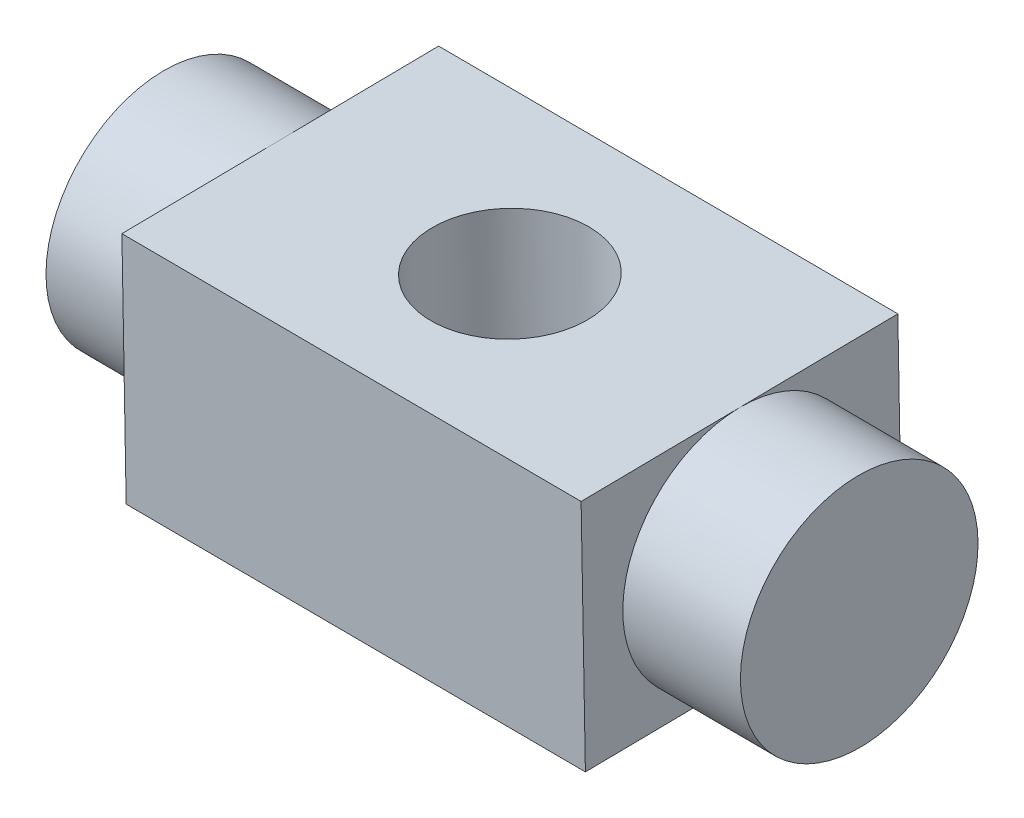
ISO-10303-21;
HEADER;
FILE_DESCRIPTION(('STEP AP214'),'2;1');
FILE_NAME('part.step','',(''),(''),'','','');
FILE_SCHEMA(('AUTOMOTIVE_DESIGN { 1 0 10303 214 1 1 1 1 }'));
ENDSEC;
DATA;
#1=APPLICATION_CONTEXT('core data for automotive mechanical design processes');
#2=APPLICATION_PROTOCOL_DEFINITION('international standard','automotive_design',2000,#1);
#3=PRODUCT_CONTEXT('',#1,'mechanical');
#4=PRODUCT('Part','Part','',(#3));
#5=PRODUCT_RELATED_PRODUCT_CATEGORY('part','',(#4));
#6=PRODUCT_DEFINITION_FORMATION('','',#4);
#7=PRODUCT_DEFINITION_CONTEXT('part definition',#1,'design');
#8=PRODUCT_DEFINITION('design','',#6,#7);
#9=PRODUCT_DEFINITION_SHAPE('','',#8);
#10=(LENGTH_UNIT() NAMED_UNIT(*) SI_UNIT(.MILLI.,.METRE.));
#11=(NAMED_UNIT(*) PLANE_ANGLE_UNIT() SI_UNIT($,.RADIAN.));
#12=(NAMED_UNIT(*) SI_UNIT($,.STERADIAN.) SOLID_ANGLE_UNIT());
#13=UNCERTAINTY_MEASURE_WITH_UNIT(LENGTH_MEASURE(1.E-05),#10,'distance_accuracy_value','');
#14=(GEOMETRIC_REPRESENTATION_CONTEXT(3) GLOBAL_UNCERTAINTY_ASSIGNED_CONTEXT((#13)) GLOBAL_UNIT_ASSIGNED_CONTEXT((#10,
#11,#12)) REPRESENTATION_CONTEXT('',''));
#15=CARTESIAN_POINT('',(0.,0.,0.));
#16=DIRECTION('',(0.,0.,1.));
#17=DIRECTION('',(1.,0.,0.));
#18=AXIS2_PLACEMENT_3D('',#15,#16,#17);
#19=CARTESIAN_POINT('',(0.00999526123676279,8.28598475368137,-1.99965126766026));
#20=DIRECTION('',(0.00499763061838042,0.0179923768409701,-0.999825633830127));
#21=DIRECTION('',(-8.99338113296644E-05,0.999838124085901,0.0179921520751982));
#22=AXIS2_PLACEMENT_3D('',#19,#20,#21);
#23=PLANE('',#22);
#24=DIRECTION('',(-8.99338113285542E-05,0.999838124085901,0.0179921520751982));
#25=VECTOR('',#24,1.);
#26=CARTESIAN_POINT('',(-2.91827772565965,6.78622756755307,-2.04127714900682));
#27=LINE('',#26,#25);
#28=CARTESIAN_POINT('',(-2.91827772565965,6.78622756755307,-2.04127714900682));
#29=VERTEX_POINT('',#28);
#30=CARTESIAN_POINT('',(-2.91854752709363,9.78574193981077,-1.98730069278123));
#31=VERTEX_POINT('',#30);
#32=EDGE_CURVE('E11',#29,#31,#27,.T.);
#33=ORIENTED_EDGE('',*,*,#32,.T.);
#34=DIRECTION('',(0.999987507722027,-1.87263780084994E-13,0.00499843974537991));
#35=VECTOR('',#34,1.);
#36=CARTESIAN_POINT('',(-2.91854752709363,9.78574193981077,-1.98730069278123));
#37=LINE('',#36,#35);
#38=CARTESIAN_POINT('',(2.93826824813318,9.78574193980968,-1.9580253863137));
#39=VERTEX_POINT('',#38);
#40=EDGE_CURVE('E25',#31,#39,#37,.T.);
#41=ORIENTED_EDGE('',*,*,#40,.T.);
#42=DIRECTION('',(8.99338113296644E-05,-0.999838124085901,-0.0179921520751982));
#43=VECTOR('',#42,1.);
#44=CARTESIAN_POINT('',(2.93853804956717,6.78622756755198,-2.01200184253929));
#45=LINE('',#44,#43);
#46=CARTESIAN_POINT('',(2.93853804956717,6.78622756755198,-2.01200184253929));
#47=VERTEX_POINT('',#46);
#48=EDGE_CURVE('E163',#39,#47,#45,.T.);
#49=ORIENTED_EDGE('',*,*,#48,.T.);
#50=DIRECTION('',(-0.999987507722027,1.86126613253846E-13,-0.00499843974537993));
#51=VECTOR('',#50,1.);
#52=CARTESIAN_POINT('',(2.93853804956717,6.78622756755198,-2.01200184253929));
#53=LINE('',#52,#51);
#54=EDGE_CURVE('E161',#47,#29,#53,.T.);
#55=ORIENTED_EDGE('',*,*,#54,.T.);
#56=EDGE_LOOP('',(#33,#41,#49,#55));
#57=FACE_BOUND('',#56,.T.);
#58=ADVANCED_FACE('F17',(#57),#23,.T.);
#59=CARTESIAN_POINT('',(-2.92854278833039,9.74975718612883,0.0123505748790235));
#60=DIRECTION('',(-8.9933811328527E-05,0.999838124085901,0.0179921520751982));
#61=DIRECTION('',(0.999987507722027,-1.87263780084993E-13,0.00499843974537991));
#62=AXIS2_PLACEMENT_3D('',#59,#60,#61);
#63=PLANE('',#62);
#64=CARTESIAN_POINT('',(-0.000134900716996975,9.74975718612828,0.0269882281127875));
#65=DIRECTION('',(8.9933811328527E-05,-0.999838124085901,-0.0179921520751982));
#66=DIRECTION('',(0.00499763061838042,0.0179923768409701,-0.999825633830127));
#67=AXIS2_PLACEMENT_3D('',#64,#65,#66);
#68=CIRCLE('',#67,1.);
#69=CARTESIAN_POINT('',(0.00486272990138344,9.76774956296925,-0.972837405717339));
#70=VERTEX_POINT('',#69);
#71=EDGE_CURVE('E156',#70,#70,#68,.T.);
#72=ORIENTED_EDGE('',*,*,#71,.T.);
#73=EDGE_LOOP('',(#72));
#74=FACE_BOUND('',#73,.T.);
#75=DIRECTION('',(0.00499763061838042,0.0179923768409701,-0.999825633830127));
#76=VECTOR('',#75,1.);
#77=CARTESIAN_POINT('',(2.92827298689642,9.74975718612774,0.0416258813465515));
#78=LINE('',#77,#76);
#79=CARTESIAN_POINT('',(2.91827772565966,9.7137724324458,2.04127714900681));
#80=VERTEX_POINT('',#79);
#81=CARTESIAN_POINT('',(2.92827298689642,9.74975718612774,0.0416258813465517));
#82=VERTEX_POINT('',#81);
#83=EDGE_CURVE('E152',#80,#82,#78,.T.);
#84=ORIENTED_EDGE('',*,*,#83,.T.);
#85=DIRECTION('',(0.00499763061838042,0.0179923768409701,-0.999825633830127));
#86=VECTOR('',#85,1.);
#87=CARTESIAN_POINT('',(2.92827298689642,9.74975718612774,0.0416258813465515));
#88=LINE('',#87,#86);
#89=EDGE_CURVE('E148',#82,#39,#88,.T.);
#90=ORIENTED_EDGE('',*,*,#89,.T.);
#91=ORIENTED_EDGE('',*,*,#40,.F.);
#92=DIRECTION('',(0.00499763061838042,0.0179923768409701,-0.999825633830127));
#93=VECTOR('',#92,1.);
#94=CARTESIAN_POINT('',(-2.92854278833039,9.74975718612883,0.0123505748790235));
#95=LINE('',#94,#93);
#96=CARTESIAN_POINT('',(-2.92854278833039,9.74975718612883,0.0123505748790233));
#97=VERTEX_POINT('',#96);
#98=EDGE_CURVE('E144',#97,#31,#95,.T.);
#99=ORIENTED_EDGE('',*,*,#98,.F.);
#100=DIRECTION('',(0.00499763061838042,0.0179923768409701,-0.999825633830127));
#101=VECTOR('',#100,1.);
#102=CARTESIAN_POINT('',(-2.92854278833039,9.74975718612883,0.0123505748790235));
#103=LINE('',#102,#101);
#104=CARTESIAN_POINT('',(-2.93853804956715,9.71377243244689,2.01200184253927));
#105=VERTEX_POINT('',#104);
#106=EDGE_CURVE('E82',#105,#97,#103,.T.);
#107=ORIENTED_EDGE('',*,*,#106,.F.);
#108=DIRECTION('',(-0.999987507722027,1.87263780084994E-13,-0.00499843974537991));
#109=VECTOR('',#108,1.);
#110=CARTESIAN_POINT('',(-2.93853804956715,9.71377243244689,2.01200184253927));
#111=LINE('',#110,#109);
#112=EDGE_CURVE('E138',#80,#105,#111,.T.);
#113=ORIENTED_EDGE('',*,*,#112,.F.);
#114=EDGE_LOOP('',(#84,#90,#91,#99,#107,#113));
#115=FACE_BOUND('',#114,.T.);
#116=ADVANCED_FACE('F188',(#74,#115),#63,.T.);
#117=CARTESIAN_POINT('',(2.92854278833041,6.75024281387004,-0.0123505748790431));
#118=DIRECTION('',(8.99338113296644E-05,-0.999838124085901,-0.0179921520751982));
#119=DIRECTION('',(-0.999987507722027,1.86126613253846E-13,-0.00499843974537993));
#120=AXIS2_PLACEMENT_3D('',#117,#118,#119);
#121=PLANE('',#120);
#122=CARTESIAN_POINT('',(0.000134900716992018,6.75024281387058,-0.0269882281128071));
#123=DIRECTION('',(-8.99338113296644E-05,0.999838124085901,0.0179921520751982));
#124=DIRECTION('',(0.00499763061838042,0.0179923768409701,-0.999825633830127));
#125=AXIS2_PLACEMENT_3D('',#122,#123,#124);
#126=CIRCLE('',#125,1.);
#127=CARTESIAN_POINT('',(0.00513253133537244,6.76823519071155,-1.02681386194293));
#128=VERTEX_POINT('',#127);
#129=EDGE_CURVE('E92',#128,#128,#126,.T.);
#130=ORIENTED_EDGE('',*,*,#129,.T.);
#131=EDGE_LOOP('',(#130));
#132=FACE_BOUND('',#131,.T.);
#133=DIRECTION('',(-0.00499763061838042,-0.0179923768409701,0.999825633830127));
#134=VECTOR('',#133,1.);
#135=CARTESIAN_POINT('',(-2.92827298689642,6.75024281387113,-0.0416258813465712));
#136=LINE('',#135,#134);
#137=CARTESIAN_POINT('',(-2.92827298689642,6.75024281387113,-0.0416258813465712));
#138=VERTEX_POINT('',#137);
#139=EDGE_CURVE('E70',#29,#138,#136,.T.);
#140=ORIENTED_EDGE('',*,*,#139,.F.);
#141=ORIENTED_EDGE('',*,*,#54,.F.);
#142=DIRECTION('',(0.00499763061838042,0.0179923768409701,-0.999825633830127));
#143=VECTOR('',#142,1.);
#144=CARTESIAN_POINT('',(2.92854278833041,6.75024281387004,-0.0123505748790431));
#145=LINE('',#144,#143);
#146=CARTESIAN_POINT('',(2.92854278833041,6.75024281387004,-0.0123505748790429));
#147=VERTEX_POINT('',#146);
#148=EDGE_CURVE('E93',#147,#47,#145,.T.);
#149=ORIENTED_EDGE('',*,*,#148,.F.);
#150=DIRECTION('',(0.00499763061838042,0.0179923768409701,-0.999825633830127));
#151=VECTOR('',#150,1.);
#152=CARTESIAN_POINT('',(2.92854278833041,6.75024281387004,-0.0123505748790431));
#153=LINE('',#152,#151);
#154=CARTESIAN_POINT('',(2.91854752709364,6.7142580601881,1.98730069278121));
#155=VERTEX_POINT('',#154);
#156=EDGE_CURVE('E123',#155,#147,#153,.T.);
#157=ORIENTED_EDGE('',*,*,#156,.F.);
#158=DIRECTION('',(0.999987507722027,-1.86126613253846E-13,0.00499843974537993));
#159=VECTOR('',#158,1.);
#160=CARTESIAN_POINT('',(2.91854752709364,6.7142580601881,1.98730069278121));
#161=LINE('',#160,#159);
#162=CARTESIAN_POINT('',(-2.93826824813317,6.71425806018919,1.95802538631368));
#163=VERTEX_POINT('',#162);
#164=EDGE_CURVE('E72',#163,#155,#161,.T.);
#165=ORIENTED_EDGE('',*,*,#164,.F.);
#166=DIRECTION('',(-0.00499763061838042,-0.0179923768409701,0.999825633830127));
#167=VECTOR('',#166,1.);
#168=CARTESIAN_POINT('',(-2.92827298689642,6.75024281387113,-0.0416258813465712));
#169=LINE('',#168,#167);
#170=EDGE_CURVE('E65',#138,#163,#169,.T.);
#171=ORIENTED_EDGE('',*,*,#170,.F.);
#172=EDGE_LOOP('',(#140,#141,#149,#157,#165,#171));
#173=FACE_BOUND('',#172,.T.);
#174=ADVANCED_FACE('F67',(#132,#173),#121,.T.);
#175=CARTESIAN_POINT('',(-0.00999526123675887,8.21401524631749,1.99965126766024));
#176=DIRECTION('',(-0.00499763061838042,-0.0179923768409701,0.999825633830127));
#177=DIRECTION('',(8.99338113296644E-05,-0.999838124085901,-0.0179921520751982));
#178=AXIS2_PLACEMENT_3D('',#175,#176,#177);
#179=PLANE('',#178);
#180=DIRECTION('',(8.99338113285542E-05,-0.999838124085901,-0.0179921520751982));
#181=VECTOR('',#180,1.);
#182=CARTESIAN_POINT('',(-2.93826824813317,6.71425806018919,1.95802538631368));
#183=LINE('',#182,#181);
#184=EDGE_CURVE('E76',#105,#163,#183,.T.);
#185=ORIENTED_EDGE('',*,*,#184,.T.);
#186=ORIENTED_EDGE('',*,*,#164,.T.);
#187=DIRECTION('',(-8.99338113296644E-05,0.999838124085901,0.0179921520751982));
#188=VECTOR('',#187,1.);
#189=CARTESIAN_POINT('',(2.91854752709364,6.7142580601881,1.98730069278121));
#190=LINE('',#189,#188);
#191=EDGE_CURVE('E112',#155,#80,#190,.T.);
#192=ORIENTED_EDGE('',*,*,#191,.T.);
#193=ORIENTED_EDGE('',*,*,#112,.T.);
#194=EDGE_LOOP('',(#185,#186,#192,#193));
#195=FACE_BOUND('',#194,.T.);
#196=ADVANCED_FACE('F186',(#195),#179,.T.);
#197=CARTESIAN_POINT('',(2.92827298689642,9.74975718612774,0.0416258813465515));
#198=DIRECTION('',(0.999987507722027,-1.86126613253846E-13,0.00499843974537993));
#199=DIRECTION('',(8.99338113296644E-05,-0.999838124085901,-0.0179921520751982));
#200=AXIS2_PLACEMENT_3D('',#197,#198,#199);
#201=PLANE('',#200);
#202=CARTESIAN_POINT('',(2.92840788761342,8.24999999999889,0.014637653233754));
#203=DIRECTION('',(-0.999987507722027,1.86126613253846E-13,-0.00499843974537993));
#204=DIRECTION('',(0.00499763061838042,0.0179923768409701,-0.999825633830127));
#205=AXIS2_PLACEMENT_3D('',#202,#203,#204);
#206=CIRCLE('',#205,1.5);
#207=EDGE_CURVE('E111',#147,#82,#206,.T.);
#208=ORIENTED_EDGE('',*,*,#207,.T.);
#209=ORIENTED_EDGE('',*,*,#83,.F.);
#210=ORIENTED_EDGE('',*,*,#191,.F.);
#211=ORIENTED_EDGE('',*,*,#156,.T.);
#212=EDGE_LOOP('',(#208,#209,#210,#211));
#213=FACE_BOUND('',#212,.T.);
#214=ADVANCED_FACE('F183',(#213),#201,.T.);
#215=EDGE_CURVE('E108',#82,#147,#206,.T.);
#216=ORIENTED_EDGE('',*,*,#215,.T.);
#217=ORIENTED_EDGE('',*,*,#148,.T.);
#218=ORIENTED_EDGE('',*,*,#48,.F.);
#219=ORIENTED_EDGE('',*,*,#89,.F.);
#220=EDGE_LOOP('',(#216,#217,#218,#219));
#221=FACE_BOUND('',#220,.T.);
#222=ADVANCED_FACE('F174',(#221),#201,.T.);
#223=CARTESIAN_POINT('',(4.42838914919646,8.24999999999861,0.0221353128518243));
#224=DIRECTION('',(0.999987507722027,-1.86126613253846E-13,0.00499843974537993));
#225=DIRECTION('',(8.99338113296644E-05,-0.999838124085901,-0.0179921520751982));
#226=AXIS2_PLACEMENT_3D('',#223,#224,#225);
#227=PLANE('',#226);
#228=CARTESIAN_POINT('',(4.42838914919646,8.24999999999861,0.0221353128518239));
#229=DIRECTION('',(0.999987507722027,-1.86126613253846E-13,0.00499843974537993));
#230=DIRECTION('',(0.00499763061838042,0.0179923768409701,-0.999825633830127));
#231=AXIS2_PLACEMENT_3D('',#228,#229,#230);
#232=CIRCLE('',#231,1.5);
#233=CARTESIAN_POINT('',(4.43588559512403,8.27698856526006,-1.47760313789337));
#234=VERTEX_POINT('',#233);
#235=EDGE_CURVE('E86',#234,#234,#232,.T.);
#236=ORIENTED_EDGE('',*,*,#235,.T.);
#237=EDGE_LOOP('',(#236));
#238=FACE_BOUND('',#237,.T.);
#239=ADVANCED_FACE('F204',(#238),#227,.T.);
#240=CARTESIAN_POINT('',(-2.9284078876134,8.25,-0.0146376532337741));
#241=DIRECTION('',(-0.999987507722027,1.86866642124685E-13,-0.00499843974537991));
#242=DIRECTION('',(-8.99338113289242E-05,0.999838124085901,0.0179921520751982));
#243=AXIS2_PLACEMENT_3D('',#240,#241,#242);
#244=CYLINDRICAL_SURFACE('',#243,1.5);
#245=ORIENTED_EDGE('',*,*,#215,.F.);
#246=ORIENTED_EDGE('',*,*,#207,.F.);
#247=EDGE_LOOP('',(#245,#246));
#248=FACE_BOUND('',#247,.T.);
#249=ORIENTED_EDGE('',*,*,#235,.F.);
#250=EDGE_LOOP('',(#249));
#251=FACE_BOUND('',#250,.T.);
#252=ADVANCED_FACE('F179',(#248,#251),#244,.T.);
#253=CARTESIAN_POINT('',(-2.92827298689642,6.75024281387113,-0.0416258813465712));
#254=DIRECTION('',(-0.999987507722027,1.87236656560104E-13,-0.00499843974537991));
#255=DIRECTION('',(-8.99338113285542E-05,0.999838124085901,0.0179921520751982));
#256=AXIS2_PLACEMENT_3D('',#253,#254,#255);
#257=PLANE('',#256);
#258=CARTESIAN_POINT('',(-2.9284078876134,8.25,-0.0146376532337741));
#259=DIRECTION('',(0.999987507722027,-1.87236656560104E-13,0.00499843974537991));
#260=DIRECTION('',(-8.99338113289242E-05,0.999838124085901,0.0179921520751982));
#261=AXIS2_PLACEMENT_3D('',#258,#259,#260);
#262=CIRCLE('',#261,1.5);
#263=EDGE_CURVE('E80',#97,#138,#262,.T.);
#264=ORIENTED_EDGE('',*,*,#263,.T.);
#265=ORIENTED_EDGE('',*,*,#170,.T.);
#266=ORIENTED_EDGE('',*,*,#184,.F.);
#267=ORIENTED_EDGE('',*,*,#106,.T.);
#268=EDGE_LOOP('',(#264,#265,#266,#267));
#269=FACE_BOUND('',#268,.T.);
#270=ADVANCED_FACE('F81',(#269),#257,.T.);
#271=CARTESIAN_POINT('',(-2.9284078876134,8.25,-0.0146376532337741));
#272=DIRECTION('',(0.999987507722027,-1.87236656560104E-13,0.00499843974537991));
#273=DIRECTION('',(-8.99338113289242E-05,0.999838124085901,0.0179921520751982));
#274=AXIS2_PLACEMENT_3D('',#271,#272,#273);
#275=CIRCLE('',#274,1.5);
#276=EDGE_CURVE('E87',#138,#97,#275,.T.);
#277=ORIENTED_EDGE('',*,*,#276,.T.);
#278=ORIENTED_EDGE('',*,*,#98,.T.);
#279=ORIENTED_EDGE('',*,*,#32,.F.);
#280=ORIENTED_EDGE('',*,*,#139,.T.);
#281=EDGE_LOOP('',(#277,#278,#279,#280));
#282=FACE_BOUND('',#281,.T.);
#283=ADVANCED_FACE('F90',(#282),#257,.T.);
#284=CARTESIAN_POINT('',(-4.42838914919645,8.25000000000026,-0.022135312851844));
#285=DIRECTION('',(-0.999987507722027,1.86959145733539E-13,-0.00499843974537991));
#286=DIRECTION('',(-8.99338113288317E-05,0.999838124085901,0.0179921520751982));
#287=AXIS2_PLACEMENT_3D('',#284,#285,#286);
#288=PLANE('',#287);
#289=CARTESIAN_POINT('',(-4.42838914919645,8.25000000000026,-0.022135312851844));
#290=DIRECTION('',(-0.999987507722027,1.86959145733539E-13,-0.00499843974537991));
#291=DIRECTION('',(-8.99338113288317E-05,0.999838124085901,0.0179921520751982));
#292=AXIS2_PLACEMENT_3D('',#289,#290,#291);
#293=CIRCLE('',#292,1.5);
#294=CARTESIAN_POINT('',(-4.42852404991344,9.74975718612911,0.00485291526095334));
#295=VERTEX_POINT('',#294);
#296=EDGE_CURVE('E97',#295,#295,#293,.T.);
#297=ORIENTED_EDGE('',*,*,#296,.T.);
#298=EDGE_LOOP('',(#297));
#299=FACE_BOUND('',#298,.T.);
#300=ADVANCED_FACE('F211',(#299),#288,.T.);
#301=ORIENTED_EDGE('',*,*,#276,.F.);
#302=ORIENTED_EDGE('',*,*,#263,.F.);
#303=EDGE_LOOP('',(#301,#302));
#304=FACE_BOUND('',#303,.T.);
#305=ORIENTED_EDGE('',*,*,#296,.F.);
#306=EDGE_LOOP('',(#305));
#307=FACE_BOUND('',#306,.T.);
#308=ADVANCED_FACE('F95',(#304,#307),#244,.T.);
#309=CARTESIAN_POINT('',(0.000134900716992018,6.75024281387058,-0.0269882281128071));
#310=DIRECTION('',(-8.99338113296644E-05,0.999838124085901,0.0179921520751982));
#311=DIRECTION('',(0.00499763061838042,0.0179923768409701,-0.999825633830127));
#312=AXIS2_PLACEMENT_3D('',#309,#310,#311);
#313=CYLINDRICAL_SURFACE('',#312,1.);
#314=ORIENTED_EDGE('',*,*,#71,.F.);
#315=EDGE_LOOP('',(#314));
#316=FACE_BOUND('',#315,.T.);
#317=ORIENTED_EDGE('',*,*,#129,.F.);
#318=EDGE_LOOP('',(#317));
#319=FACE_BOUND('',#318,.T.);
#320=ADVANCED_FACE('F210',(#316,#319),#313,.F.);
#321=CLOSED_SHELL('',(#58,#116,#174,#196,#214,#222,#239,#252,#270,#283,#300,#308,#320));
#322=MANIFOLD_SOLID_BREP('B1',#321);
#323=ADVANCED_BREP_SHAPE_REPRESENTATION('',(#18,#322),#14);
#324=SHAPE_DEFINITION_REPRESENTATION(#9,#323);
ENDSEC;
END-ISO-10303-21;
